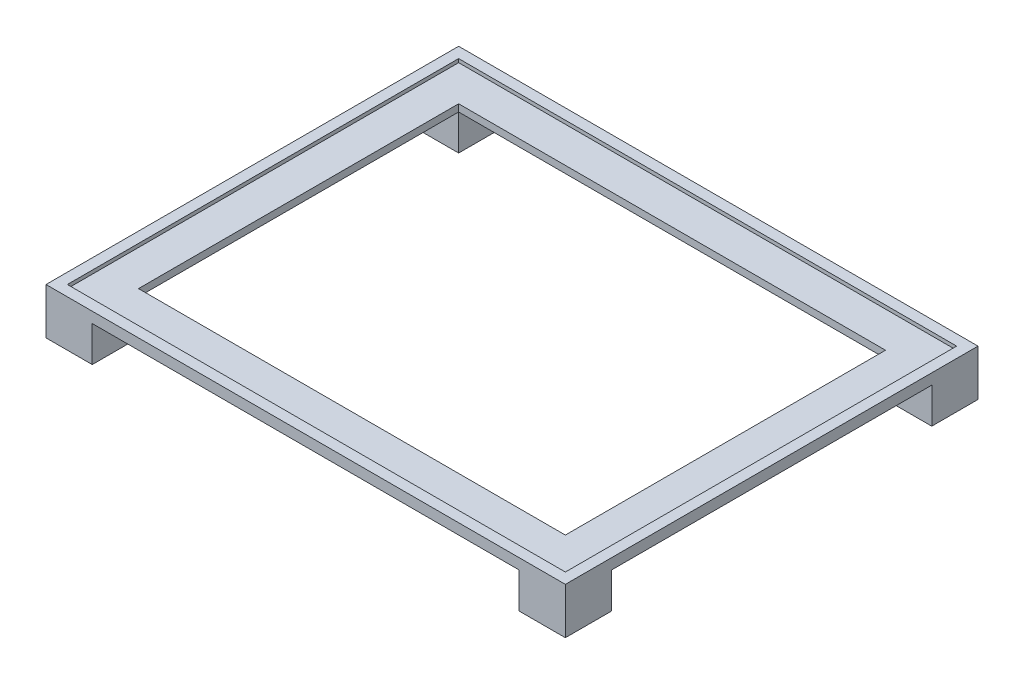
ISO-10303-21;
HEADER;
FILE_DESCRIPTION(('STEP AP214'),'2;1');
FILE_NAME('part.step','',(''),(''),'','','');
FILE_SCHEMA(('AUTOMOTIVE_DESIGN { 1 0 10303 214 1 1 1 1 }'));
ENDSEC;
DATA;
#1=APPLICATION_CONTEXT('core data for automotive mechanical design processes');
#2=APPLICATION_PROTOCOL_DEFINITION('international standard','automotive_design',2000,#1);
#3=PRODUCT_CONTEXT('',#1,'mechanical');
#4=PRODUCT('Part','Part','',(#3));
#5=PRODUCT_RELATED_PRODUCT_CATEGORY('part','',(#4));
#6=PRODUCT_DEFINITION_FORMATION('','',#4);
#7=PRODUCT_DEFINITION_CONTEXT('part definition',#1,'design');
#8=PRODUCT_DEFINITION('design','',#6,#7);
#9=PRODUCT_DEFINITION_SHAPE('','',#8);
#10=(LENGTH_UNIT() NAMED_UNIT(*) SI_UNIT(.MILLI.,.METRE.));
#11=(NAMED_UNIT(*) PLANE_ANGLE_UNIT() SI_UNIT($,.RADIAN.));
#12=(NAMED_UNIT(*) SI_UNIT($,.STERADIAN.) SOLID_ANGLE_UNIT());
#13=UNCERTAINTY_MEASURE_WITH_UNIT(LENGTH_MEASURE(1.E-05),#10,'distance_accuracy_value','');
#14=(GEOMETRIC_REPRESENTATION_CONTEXT(3) GLOBAL_UNCERTAINTY_ASSIGNED_CONTEXT((#13)) GLOBAL_UNIT_ASSIGNED_CONTEXT((#10,
#11,#12)) REPRESENTATION_CONTEXT('',''));
#15=CARTESIAN_POINT('',(0.,0.,0.));
#16=DIRECTION('',(0.,0.,1.));
#17=DIRECTION('',(1.,0.,0.));
#18=AXIS2_PLACEMENT_3D('',#15,#16,#17);
#19=CARTESIAN_POINT('',(0.,0.,0.));
#20=DIRECTION('',(0.,1.,0.));
#21=DIRECTION('',(0.,0.,1.));
#22=AXIS2_PLACEMENT_3D('',#19,#20,#21);
#23=PLANE('',#22);
#24=DIRECTION('',(0.,0.,-1.));
#25=VECTOR('',#24,1.);
#26=CARTESIAN_POINT('',(60.,0.,0.));
#27=LINE('',#26,#25);
#28=CARTESIAN_POINT('',(60.,0.,58.));
#29=VERTEX_POINT('',#28);
#30=CARTESIAN_POINT('',(60.,0.,45.));
#31=VERTEX_POINT('',#30);
#32=EDGE_CURVE('E65',#29,#31,#27,.T.);
#33=ORIENTED_EDGE('',*,*,#32,.F.);
#34=DIRECTION('',(-1.,0.,0.));
#35=VECTOR('',#34,1.);
#36=CARTESIAN_POINT('',(0.,0.,58.));
#37=LINE('',#36,#35);
#38=CARTESIAN_POINT('',(-60.,0.,58.));
#39=VERTEX_POINT('',#38);
#40=EDGE_CURVE('E224',#29,#39,#37,.T.);
#41=ORIENTED_EDGE('',*,*,#40,.T.);
#42=DIRECTION('',(0.,0.,-1.));
#43=VECTOR('',#42,1.);
#44=CARTESIAN_POINT('',(-60.0000000000001,0.,1.28102656687518E-13));
#45=LINE('',#44,#43);
#46=CARTESIAN_POINT('',(-60.,0.,45.));
#47=VERTEX_POINT('',#46);
#48=EDGE_CURVE('E299',#39,#47,#45,.T.);
#49=ORIENTED_EDGE('',*,*,#48,.T.);
#50=DIRECTION('',(-1.,0.,0.));
#51=VECTOR('',#50,1.);
#52=CARTESIAN_POINT('',(0.,0.,45.));
#53=LINE('',#52,#51);
#54=EDGE_CURVE('E338',#31,#47,#53,.T.);
#55=ORIENTED_EDGE('',*,*,#54,.F.);
#56=EDGE_LOOP('',(#33,#41,#49,#55));
#57=FACE_BOUND('',#56,.T.);
#58=ADVANCED_FACE('F47',(#57),#23,.F.);
#59=DIRECTION('',(0.,0.,1.));
#60=VECTOR('',#59,1.);
#61=CARTESIAN_POINT('',(73.,0.,0.));
#62=LINE('',#61,#60);
#63=CARTESIAN_POINT('',(73.,0.,-45.));
#64=VERTEX_POINT('',#63);
#65=CARTESIAN_POINT('',(73.,0.,45.));
#66=VERTEX_POINT('',#65);
#67=EDGE_CURVE('E73',#64,#66,#62,.T.);
#68=ORIENTED_EDGE('',*,*,#67,.T.);
#69=DIRECTION('',(-1.,0.,0.));
#70=VECTOR('',#69,1.);
#71=CARTESIAN_POINT('',(0.,0.,45.));
#72=LINE('',#71,#70);
#73=EDGE_CURVE('E220',#66,#31,#72,.T.);
#74=ORIENTED_EDGE('',*,*,#73,.T.);
#75=DIRECTION('',(0.,0.,1.));
#76=VECTOR('',#75,1.);
#77=CARTESIAN_POINT('',(60.,0.,0.));
#78=LINE('',#77,#76);
#79=CARTESIAN_POINT('',(60.,0.,-45.));
#80=VERTEX_POINT('',#79);
#81=EDGE_CURVE('E369',#80,#31,#78,.T.);
#82=ORIENTED_EDGE('',*,*,#81,.F.);
#83=DIRECTION('',(-1.,0.,0.));
#84=VECTOR('',#83,1.);
#85=CARTESIAN_POINT('',(0.,0.,-45.));
#86=LINE('',#85,#84);
#87=EDGE_CURVE('E230',#64,#80,#86,.T.);
#88=ORIENTED_EDGE('',*,*,#87,.F.);
#89=EDGE_LOOP('',(#68,#74,#82,#88));
#90=FACE_BOUND('',#89,.T.);
#91=ADVANCED_FACE('F479',(#90),#23,.F.);
#92=DIRECTION('',(-1.,0.,0.));
#93=VECTOR('',#92,1.);
#94=CARTESIAN_POINT('',(0.,0.,-58.));
#95=LINE('',#94,#93);
#96=CARTESIAN_POINT('',(60.,0.,-58.));
#97=VERTEX_POINT('',#96);
#98=CARTESIAN_POINT('',(-60.,0.,-58.));
#99=VERTEX_POINT('',#98);
#100=EDGE_CURVE('E391',#97,#99,#95,.T.);
#101=ORIENTED_EDGE('',*,*,#100,.F.);
#102=DIRECTION('',(0.,0.,1.));
#103=VECTOR('',#102,1.);
#104=CARTESIAN_POINT('',(60.,0.,0.));
#105=LINE('',#104,#103);
#106=EDGE_CURVE('E226',#97,#80,#105,.T.);
#107=ORIENTED_EDGE('',*,*,#106,.T.);
#108=DIRECTION('',(-1.,0.,0.));
#109=VECTOR('',#108,1.);
#110=CARTESIAN_POINT('',(0.,0.,-45.));
#111=LINE('',#110,#109);
#112=CARTESIAN_POINT('',(-60.,0.,-45.));
#113=VERTEX_POINT('',#112);
#114=EDGE_CURVE('E365',#80,#113,#111,.T.);
#115=ORIENTED_EDGE('',*,*,#114,.T.);
#116=DIRECTION('',(0.,0.,1.));
#117=VECTOR('',#116,1.);
#118=CARTESIAN_POINT('',(-60.0000000000001,0.,-1.28102656687518E-13));
#119=LINE('',#118,#117);
#120=EDGE_CURVE('E265',#99,#113,#119,.T.);
#121=ORIENTED_EDGE('',*,*,#120,.F.);
#122=EDGE_LOOP('',(#101,#107,#115,#121));
#123=FACE_BOUND('',#122,.T.);
#124=ADVANCED_FACE('F486',(#123),#23,.F.);
#125=CARTESIAN_POINT('',(0.,3.,-58.));
#126=DIRECTION('',(0.,0.,1.));
#127=DIRECTION('',(1.,0.,0.));
#128=AXIS2_PLACEMENT_3D('',#125,#126,#127);
#129=PLANE('',#128);
#130=DIRECTION('',(0.,-1.,0.));
#131=VECTOR('',#130,1.);
#132=CARTESIAN_POINT('',(73.,3.,-58.));
#133=LINE('',#132,#131);
#134=CARTESIAN_POINT('',(73.,3.,-58.));
#135=VERTEX_POINT('',#134);
#136=CARTESIAN_POINT('',(73.,-10.,-58.));
#137=VERTEX_POINT('',#136);
#138=EDGE_CURVE('E431',#135,#137,#133,.T.);
#139=ORIENTED_EDGE('',*,*,#138,.T.);
#140=DIRECTION('',(1.,0.,0.));
#141=VECTOR('',#140,1.);
#142=CARTESIAN_POINT('',(0.,-10.,-58.));
#143=LINE('',#142,#141);
#144=CARTESIAN_POINT('',(60.,-10.,-58.));
#145=VERTEX_POINT('',#144);
#146=EDGE_CURVE('E240',#145,#137,#143,.T.);
#147=ORIENTED_EDGE('',*,*,#146,.F.);
#148=DIRECTION('',(0.,1.,0.));
#149=VECTOR('',#148,1.);
#150=CARTESIAN_POINT('',(60.,-10.,-58.));
#151=LINE('',#150,#149);
#152=EDGE_CURVE('E261',#145,#97,#151,.T.);
#153=ORIENTED_EDGE('',*,*,#152,.T.);
#154=ORIENTED_EDGE('',*,*,#100,.T.);
#155=DIRECTION('',(0.,1.,0.));
#156=VECTOR('',#155,1.);
#157=CARTESIAN_POINT('',(-60.,-10.,-58.));
#158=LINE('',#157,#156);
#159=CARTESIAN_POINT('',(-60.,-10.,-58.));
#160=VERTEX_POINT('',#159);
#161=EDGE_CURVE('E295',#160,#99,#158,.T.);
#162=ORIENTED_EDGE('',*,*,#161,.F.);
#163=DIRECTION('',(1.,0.,0.));
#164=VECTOR('',#163,1.);
#165=CARTESIAN_POINT('',(0.,-10.,-58.));
#166=LINE('',#165,#164);
#167=CARTESIAN_POINT('',(-73.,-10.,-58.));
#168=VERTEX_POINT('',#167);
#169=EDGE_CURVE('E266',#168,#160,#166,.T.);
#170=ORIENTED_EDGE('',*,*,#169,.F.);
#171=DIRECTION('',(0.,-1.,0.));
#172=VECTOR('',#171,1.);
#173=CARTESIAN_POINT('',(-73.,3.,-58.));
#174=LINE('',#173,#172);
#175=CARTESIAN_POINT('',(-73.,3.,-58.));
#176=VERTEX_POINT('',#175);
#177=EDGE_CURVE('E11',#176,#168,#174,.T.);
#178=ORIENTED_EDGE('',*,*,#177,.F.);
#179=DIRECTION('',(-1.,0.,0.));
#180=VECTOR('',#179,1.);
#181=CARTESIAN_POINT('',(0.,3.,-58.));
#182=LINE('',#181,#180);
#183=EDGE_CURVE('E406',#135,#176,#182,.T.);
#184=ORIENTED_EDGE('',*,*,#183,.F.);
#185=EDGE_LOOP('',(#139,#147,#153,#154,#162,#170,#178,#184));
#186=FACE_BOUND('',#185,.T.);
#187=ADVANCED_FACE('F502',(#186),#129,.F.);
#188=CARTESIAN_POINT('',(-73.,3.,0.));
#189=DIRECTION('',(1.,0.,0.));
#190=DIRECTION('',(0.,0.,-1.));
#191=AXIS2_PLACEMENT_3D('',#188,#189,#190);
#192=PLANE('',#191);
#193=ORIENTED_EDGE('',*,*,#177,.T.);
#194=DIRECTION('',(0.,0.,-1.));
#195=VECTOR('',#194,1.);
#196=CARTESIAN_POINT('',(-73.,-10.,0.));
#197=LINE('',#196,#195);
#198=CARTESIAN_POINT('',(-73.,-10.,-45.));
#199=VERTEX_POINT('',#198);
#200=EDGE_CURVE('E278',#199,#168,#197,.T.);
#201=ORIENTED_EDGE('',*,*,#200,.F.);
#202=DIRECTION('',(0.,1.,0.));
#203=VECTOR('',#202,1.);
#204=CARTESIAN_POINT('',(-73.,-10.,-45.));
#205=LINE('',#204,#203);
#206=CARTESIAN_POINT('',(-73.,0.,-45.));
#207=VERTEX_POINT('',#206);
#208=EDGE_CURVE('E282',#199,#207,#205,.T.);
#209=ORIENTED_EDGE('',*,*,#208,.T.);
#210=DIRECTION('',(0.,0.,1.));
#211=VECTOR('',#210,1.);
#212=CARTESIAN_POINT('',(-73.,0.,0.));
#213=LINE('',#212,#211);
#214=CARTESIAN_POINT('',(-73.,0.,45.));
#215=VERTEX_POINT('',#214);
#216=EDGE_CURVE('E424',#207,#215,#213,.T.);
#217=ORIENTED_EDGE('',*,*,#216,.T.);
#218=DIRECTION('',(0.,1.,0.));
#219=VECTOR('',#218,1.);
#220=CARTESIAN_POINT('',(-73.,-10.,45.));
#221=LINE('',#220,#219);
#222=CARTESIAN_POINT('',(-73.,-10.,45.));
#223=VERTEX_POINT('',#222);
#224=EDGE_CURVE('E325',#223,#215,#221,.T.);
#225=ORIENTED_EDGE('',*,*,#224,.F.);
#226=DIRECTION('',(0.,0.,-1.));
#227=VECTOR('',#226,1.);
#228=CARTESIAN_POINT('',(-73.,-10.,0.));
#229=LINE('',#228,#227);
#230=CARTESIAN_POINT('',(-73.,-10.,58.));
#231=VERTEX_POINT('',#230);
#232=EDGE_CURVE('E309',#231,#223,#229,.T.);
#233=ORIENTED_EDGE('',*,*,#232,.F.);
#234=DIRECTION('',(0.,-1.,0.));
#235=VECTOR('',#234,1.);
#236=CARTESIAN_POINT('',(-73.,3.,58.));
#237=LINE('',#236,#235);
#238=CARTESIAN_POINT('',(-73.,3.,58.));
#239=VERTEX_POINT('',#238);
#240=EDGE_CURVE('E57',#239,#231,#237,.T.);
#241=ORIENTED_EDGE('',*,*,#240,.F.);
#242=DIRECTION('',(0.,0.,1.));
#243=VECTOR('',#242,1.);
#244=CARTESIAN_POINT('',(-73.,3.,0.));
#245=LINE('',#244,#243);
#246=EDGE_CURVE('E410',#176,#239,#245,.T.);
#247=ORIENTED_EDGE('',*,*,#246,.F.);
#248=EDGE_LOOP('',(#193,#201,#209,#217,#225,#233,#241,#247));
#249=FACE_BOUND('',#248,.T.);
#250=ADVANCED_FACE('F507',(#249),#192,.F.);
#251=CARTESIAN_POINT('',(0.,3.,58.));
#252=DIRECTION('',(0.,0.,1.));
#253=DIRECTION('',(1.,0.,0.));
#254=AXIS2_PLACEMENT_3D('',#251,#252,#253);
#255=PLANE('',#254);
#256=ORIENTED_EDGE('',*,*,#40,.F.);
#257=DIRECTION('',(0.,1.,0.));
#258=VECTOR('',#257,1.);
#259=CARTESIAN_POINT('',(60.,-10.,58.));
#260=LINE('',#259,#258);
#261=CARTESIAN_POINT('',(60.,-10.,58.));
#262=VERTEX_POINT('',#261);
#263=EDGE_CURVE('E203',#262,#29,#260,.T.);
#264=ORIENTED_EDGE('',*,*,#263,.F.);
#265=DIRECTION('',(-1.,0.,0.));
#266=VECTOR('',#265,1.);
#267=CARTESIAN_POINT('',(0.,-10.,58.));
#268=LINE('',#267,#266);
#269=CARTESIAN_POINT('',(73.,-10.,58.));
#270=VERTEX_POINT('',#269);
#271=EDGE_CURVE('E211',#270,#262,#268,.T.);
#272=ORIENTED_EDGE('',*,*,#271,.F.);
#273=DIRECTION('',(0.,-1.,0.));
#274=VECTOR('',#273,1.);
#275=CARTESIAN_POINT('',(73.,3.,58.));
#276=LINE('',#275,#274);
#277=CARTESIAN_POINT('',(73.,3.,58.));
#278=VERTEX_POINT('',#277);
#279=EDGE_CURVE('E434',#278,#270,#276,.T.);
#280=ORIENTED_EDGE('',*,*,#279,.F.);
#281=DIRECTION('',(-1.,0.,0.));
#282=VECTOR('',#281,1.);
#283=CARTESIAN_POINT('',(0.,3.,58.));
#284=LINE('',#283,#282);
#285=EDGE_CURVE('E413',#278,#239,#284,.T.);
#286=ORIENTED_EDGE('',*,*,#285,.T.);
#287=ORIENTED_EDGE('',*,*,#240,.T.);
#288=DIRECTION('',(-1.,0.,0.));
#289=VECTOR('',#288,1.);
#290=CARTESIAN_POINT('',(0.,-10.,58.));
#291=LINE('',#290,#289);
#292=CARTESIAN_POINT('',(-60.,-10.,58.));
#293=VERTEX_POINT('',#292);
#294=EDGE_CURVE('E304',#293,#231,#291,.T.);
#295=ORIENTED_EDGE('',*,*,#294,.F.);
#296=DIRECTION('',(0.,1.,0.));
#297=VECTOR('',#296,1.);
#298=CARTESIAN_POINT('',(-60.,-10.,58.));
#299=LINE('',#298,#297);
#300=EDGE_CURVE('E329',#293,#39,#299,.T.);
#301=ORIENTED_EDGE('',*,*,#300,.T.);
#302=EDGE_LOOP('',(#256,#264,#272,#280,#286,#287,#295,#301));
#303=FACE_BOUND('',#302,.T.);
#304=ADVANCED_FACE('F222',(#303),#255,.T.);
#305=CARTESIAN_POINT('',(-70.,3.,0.));
#306=DIRECTION('',(1.,0.,0.));
#307=DIRECTION('',(0.,0.,-1.));
#308=AXIS2_PLACEMENT_3D('',#305,#306,#307);
#309=PLANE('',#308);
#310=DIRECTION('',(0.,0.,1.));
#311=VECTOR('',#310,1.);
#312=CARTESIAN_POINT('',(-70.,2.,0.));
#313=LINE('',#312,#311);
#314=CARTESIAN_POINT('',(-70.,2.,-55.));
#315=VERTEX_POINT('',#314);
#316=CARTESIAN_POINT('',(-70.,2.,55.));
#317=VERTEX_POINT('',#316);
#318=EDGE_CURVE('E351',#315,#317,#313,.T.);
#319=ORIENTED_EDGE('',*,*,#318,.F.);
#320=DIRECTION('',(0.,-1.,0.));
#321=VECTOR('',#320,1.);
#322=CARTESIAN_POINT('',(-70.,3.,-55.));
#323=LINE('',#322,#321);
#324=CARTESIAN_POINT('',(-70.,3.,-55.));
#325=VERTEX_POINT('',#324);
#326=EDGE_CURVE('E51',#325,#315,#323,.T.);
#327=ORIENTED_EDGE('',*,*,#326,.F.);
#328=DIRECTION('',(0.,0.,1.));
#329=VECTOR('',#328,1.);
#330=CARTESIAN_POINT('',(-70.,3.,0.));
#331=LINE('',#330,#329);
#332=CARTESIAN_POINT('',(-70.,3.,55.));
#333=VERTEX_POINT('',#332);
#334=EDGE_CURVE('E392',#325,#333,#331,.T.);
#335=ORIENTED_EDGE('',*,*,#334,.T.);
#336=DIRECTION('',(0.,-1.,0.));
#337=VECTOR('',#336,1.);
#338=CARTESIAN_POINT('',(-70.,3.,55.));
#339=LINE('',#338,#337);
#340=EDGE_CURVE('E421',#333,#317,#339,.T.);
#341=ORIENTED_EDGE('',*,*,#340,.T.);
#342=EDGE_LOOP('',(#319,#327,#335,#341));
#343=FACE_BOUND('',#342,.T.);
#344=ADVANCED_FACE('F49',(#343),#309,.T.);
#345=CARTESIAN_POINT('',(0.,3.,-55.));
#346=DIRECTION('',(0.,0.,1.));
#347=DIRECTION('',(1.,0.,0.));
#348=AXIS2_PLACEMENT_3D('',#345,#346,#347);
#349=PLANE('',#348);
#350=DIRECTION('',(-1.,0.,0.));
#351=VECTOR('',#350,1.);
#352=CARTESIAN_POINT('',(0.,2.,-55.));
#353=LINE('',#352,#351);
#354=CARTESIAN_POINT('',(70.,2.,-55.));
#355=VERTEX_POINT('',#354);
#356=EDGE_CURVE('E348',#355,#315,#353,.T.);
#357=ORIENTED_EDGE('',*,*,#356,.F.);
#358=DIRECTION('',(0.,-1.,0.));
#359=VECTOR('',#358,1.);
#360=CARTESIAN_POINT('',(70.,3.,-55.));
#361=LINE('',#360,#359);
#362=CARTESIAN_POINT('',(70.,3.,-55.));
#363=VERTEX_POINT('',#362);
#364=EDGE_CURVE('E445',#363,#355,#361,.T.);
#365=ORIENTED_EDGE('',*,*,#364,.F.);
#366=DIRECTION('',(-1.,0.,0.));
#367=VECTOR('',#366,1.);
#368=CARTESIAN_POINT('',(0.,3.,-55.));
#369=LINE('',#368,#367);
#370=EDGE_CURVE('E396',#363,#325,#369,.T.);
#371=ORIENTED_EDGE('',*,*,#370,.T.);
#372=ORIENTED_EDGE('',*,*,#326,.T.);
#373=EDGE_LOOP('',(#357,#365,#371,#372));
#374=FACE_BOUND('',#373,.T.);
#375=ADVANCED_FACE('F454',(#374),#349,.T.);
#376=CARTESIAN_POINT('',(70.,3.,0.));
#377=DIRECTION('',(1.,0.,0.));
#378=DIRECTION('',(0.,0.,-1.));
#379=AXIS2_PLACEMENT_3D('',#376,#377,#378);
#380=PLANE('',#379);
#381=ORIENTED_EDGE('',*,*,#364,.T.);
#382=DIRECTION('',(0.,0.,1.));
#383=VECTOR('',#382,1.);
#384=CARTESIAN_POINT('',(70.,2.,0.));
#385=LINE('',#384,#383);
#386=CARTESIAN_POINT('',(70.,2.,55.));
#387=VERTEX_POINT('',#386);
#388=EDGE_CURVE('E358',#355,#387,#385,.T.);
#389=ORIENTED_EDGE('',*,*,#388,.T.);
#390=DIRECTION('',(0.,-1.,0.));
#391=VECTOR('',#390,1.);
#392=CARTESIAN_POINT('',(70.,3.,55.));
#393=LINE('',#392,#391);
#394=CARTESIAN_POINT('',(70.,3.,55.));
#395=VERTEX_POINT('',#394);
#396=EDGE_CURVE('E442',#395,#387,#393,.T.);
#397=ORIENTED_EDGE('',*,*,#396,.F.);
#398=DIRECTION('',(0.,0.,1.));
#399=VECTOR('',#398,1.);
#400=CARTESIAN_POINT('',(70.,3.,0.));
#401=LINE('',#400,#399);
#402=EDGE_CURVE('E400',#363,#395,#401,.T.);
#403=ORIENTED_EDGE('',*,*,#402,.F.);
#404=EDGE_LOOP('',(#381,#389,#397,#403));
#405=FACE_BOUND('',#404,.T.);
#406=ADVANCED_FACE('F469',(#405),#380,.F.);
#407=CARTESIAN_POINT('',(0.,3.,55.));
#408=DIRECTION('',(0.,0.,1.));
#409=DIRECTION('',(1.,0.,0.));
#410=AXIS2_PLACEMENT_3D('',#407,#408,#409);
#411=PLANE('',#410);
#412=ORIENTED_EDGE('',*,*,#396,.T.);
#413=DIRECTION('',(-1.,0.,0.));
#414=VECTOR('',#413,1.);
#415=CARTESIAN_POINT('',(0.,2.,55.));
#416=LINE('',#415,#414);
#417=EDGE_CURVE('E354',#387,#317,#416,.T.);
#418=ORIENTED_EDGE('',*,*,#417,.T.);
#419=ORIENTED_EDGE('',*,*,#340,.F.);
#420=DIRECTION('',(-1.,0.,0.));
#421=VECTOR('',#420,1.);
#422=CARTESIAN_POINT('',(0.,3.,55.));
#423=LINE('',#422,#421);
#424=EDGE_CURVE('E403',#395,#333,#423,.T.);
#425=ORIENTED_EDGE('',*,*,#424,.F.);
#426=EDGE_LOOP('',(#412,#418,#419,#425));
#427=FACE_BOUND('',#426,.T.);
#428=ADVANCED_FACE('F466',(#427),#411,.F.);
#429=CARTESIAN_POINT('',(73.,3.,0.));
#430=DIRECTION('',(1.,0.,0.));
#431=DIRECTION('',(0.,0.,-1.));
#432=AXIS2_PLACEMENT_3D('',#429,#430,#431);
#433=PLANE('',#432);
#434=ORIENTED_EDGE('',*,*,#67,.F.);
#435=DIRECTION('',(0.,1.,0.));
#436=VECTOR('',#435,1.);
#437=CARTESIAN_POINT('',(73.,-10.,-45.));
#438=LINE('',#437,#436);
#439=CARTESIAN_POINT('',(73.,-10.,-45.));
#440=VERTEX_POINT('',#439);
#441=EDGE_CURVE('E257',#440,#64,#438,.T.);
#442=ORIENTED_EDGE('',*,*,#441,.F.);
#443=DIRECTION('',(0.,0.,1.));
#444=VECTOR('',#443,1.);
#445=CARTESIAN_POINT('',(73.,-10.,0.));
#446=LINE('',#445,#444);
#447=EDGE_CURVE('E244',#137,#440,#446,.T.);
#448=ORIENTED_EDGE('',*,*,#447,.F.);
#449=ORIENTED_EDGE('',*,*,#138,.F.);
#450=DIRECTION('',(0.,0.,1.));
#451=VECTOR('',#450,1.);
#452=CARTESIAN_POINT('',(73.,3.,0.));
#453=LINE('',#452,#451);
#454=EDGE_CURVE('E417',#135,#278,#453,.T.);
#455=ORIENTED_EDGE('',*,*,#454,.T.);
#456=ORIENTED_EDGE('',*,*,#279,.T.);
#457=DIRECTION('',(0.,0.,1.));
#458=VECTOR('',#457,1.);
#459=CARTESIAN_POINT('',(73.,-10.,0.));
#460=LINE('',#459,#458);
#461=CARTESIAN_POINT('',(73.,-10.,45.));
#462=VERTEX_POINT('',#461);
#463=EDGE_CURVE('E217',#462,#270,#460,.T.);
#464=ORIENTED_EDGE('',*,*,#463,.F.);
#465=DIRECTION('',(0.,1.,0.));
#466=VECTOR('',#465,1.);
#467=CARTESIAN_POINT('',(73.,-10.,45.));
#468=LINE('',#467,#466);
#469=EDGE_CURVE('E232',#462,#66,#468,.T.);
#470=ORIENTED_EDGE('',*,*,#469,.T.);
#471=EDGE_LOOP('',(#434,#442,#448,#449,#455,#456,#464,#470));
#472=FACE_BOUND('',#471,.T.);
#473=ADVANCED_FACE('F476',(#472),#433,.T.);
#474=CARTESIAN_POINT('',(0.,3.,0.));
#475=DIRECTION('',(0.,1.,0.));
#476=DIRECTION('',(0.,0.,1.));
#477=AXIS2_PLACEMENT_3D('',#474,#475,#476);
#478=PLANE('',#477);
#479=ORIENTED_EDGE('',*,*,#334,.F.);
#480=ORIENTED_EDGE('',*,*,#370,.F.);
#481=ORIENTED_EDGE('',*,*,#402,.T.);
#482=ORIENTED_EDGE('',*,*,#424,.T.);
#483=EDGE_LOOP('',(#479,#480,#481,#482));
#484=FACE_BOUND('',#483,.T.);
#485=ORIENTED_EDGE('',*,*,#183,.T.);
#486=ORIENTED_EDGE('',*,*,#246,.T.);
#487=ORIENTED_EDGE('',*,*,#285,.F.);
#488=ORIENTED_EDGE('',*,*,#454,.F.);
#489=EDGE_LOOP('',(#485,#486,#487,#488));
#490=FACE_BOUND('',#489,.T.);
#491=ADVANCED_FACE('F460',(#484,#490),#478,.T.);
#492=ORIENTED_EDGE('',*,*,#216,.F.);
#493=DIRECTION('',(1.,0.,0.));
#494=VECTOR('',#493,1.);
#495=CARTESIAN_POINT('',(0.,0.,-45.));
#496=LINE('',#495,#494);
#497=EDGE_CURVE('E271',#207,#113,#496,.T.);
#498=ORIENTED_EDGE('',*,*,#497,.T.);
#499=DIRECTION('',(0.,0.,1.));
#500=VECTOR('',#499,1.);
#501=CARTESIAN_POINT('',(-60.,0.,0.));
#502=LINE('',#501,#500);
#503=EDGE_CURVE('E332',#113,#47,#502,.T.);
#504=ORIENTED_EDGE('',*,*,#503,.T.);
#505=DIRECTION('',(1.,0.,0.));
#506=VECTOR('',#505,1.);
#507=CARTESIAN_POINT('',(0.,0.,45.));
#508=LINE('',#507,#506);
#509=EDGE_CURVE('E305',#215,#47,#508,.T.);
#510=ORIENTED_EDGE('',*,*,#509,.F.);
#511=EDGE_LOOP('',(#492,#498,#504,#510));
#512=FACE_BOUND('',#511,.T.);
#513=ADVANCED_FACE('F481',(#512),#23,.F.);
#514=CARTESIAN_POINT('',(-60.,2.,0.));
#515=DIRECTION('',(1.,0.,0.));
#516=DIRECTION('',(0.,0.,-1.));
#517=AXIS2_PLACEMENT_3D('',#514,#515,#516);
#518=PLANE('',#517);
#519=ORIENTED_EDGE('',*,*,#503,.F.);
#520=DIRECTION('',(0.,-1.,0.));
#521=VECTOR('',#520,1.);
#522=CARTESIAN_POINT('',(-60.,2.,-45.));
#523=LINE('',#522,#521);
#524=CARTESIAN_POINT('',(-60.,2.,-45.));
#525=VERTEX_POINT('',#524);
#526=EDGE_CURVE('E387',#525,#113,#523,.T.);
#527=ORIENTED_EDGE('',*,*,#526,.F.);
#528=DIRECTION('',(0.,0.,1.));
#529=VECTOR('',#528,1.);
#530=CARTESIAN_POINT('',(-60.,2.,0.));
#531=LINE('',#530,#529);
#532=CARTESIAN_POINT('',(-60.,2.,45.));
#533=VERTEX_POINT('',#532);
#534=EDGE_CURVE('E333',#525,#533,#531,.T.);
#535=ORIENTED_EDGE('',*,*,#534,.T.);
#536=DIRECTION('',(0.,-1.,0.));
#537=VECTOR('',#536,1.);
#538=CARTESIAN_POINT('',(-60.,2.,45.));
#539=LINE('',#538,#537);
#540=EDGE_CURVE('E362',#533,#47,#539,.T.);
#541=ORIENTED_EDGE('',*,*,#540,.T.);
#542=EDGE_LOOP('',(#519,#527,#535,#541));
#543=FACE_BOUND('',#542,.T.);
#544=ADVANCED_FACE('F490',(#543),#518,.T.);
#545=CARTESIAN_POINT('',(0.,2.,-45.));
#546=DIRECTION('',(0.,0.,1.));
#547=DIRECTION('',(1.,0.,0.));
#548=AXIS2_PLACEMENT_3D('',#545,#546,#547);
#549=PLANE('',#548);
#550=ORIENTED_EDGE('',*,*,#114,.F.);
#551=DIRECTION('',(0.,-1.,0.));
#552=VECTOR('',#551,1.);
#553=CARTESIAN_POINT('',(60.,2.,-45.));
#554=LINE('',#553,#552);
#555=CARTESIAN_POINT('',(60.,2.,-45.));
#556=VERTEX_POINT('',#555);
#557=EDGE_CURVE('E383',#556,#80,#554,.T.);
#558=ORIENTED_EDGE('',*,*,#557,.F.);
#559=DIRECTION('',(-1.,0.,0.));
#560=VECTOR('',#559,1.);
#561=CARTESIAN_POINT('',(0.,2.,-45.));
#562=LINE('',#561,#560);
#563=EDGE_CURVE('E337',#556,#525,#562,.T.);
#564=ORIENTED_EDGE('',*,*,#563,.T.);
#565=ORIENTED_EDGE('',*,*,#526,.T.);
#566=EDGE_LOOP('',(#550,#558,#564,#565));
#567=FACE_BOUND('',#566,.T.);
#568=ADVANCED_FACE('F496',(#567),#549,.T.);
#569=CARTESIAN_POINT('',(60.,2.,0.));
#570=DIRECTION('',(1.,0.,0.));
#571=DIRECTION('',(0.,0.,-1.));
#572=AXIS2_PLACEMENT_3D('',#569,#570,#571);
#573=PLANE('',#572);
#574=ORIENTED_EDGE('',*,*,#81,.T.);
#575=DIRECTION('',(0.,-1.,0.));
#576=VECTOR('',#575,1.);
#577=CARTESIAN_POINT('',(60.,2.,45.));
#578=LINE('',#577,#576);
#579=CARTESIAN_POINT('',(60.,2.,45.));
#580=VERTEX_POINT('',#579);
#581=EDGE_CURVE('E379',#580,#31,#578,.T.);
#582=ORIENTED_EDGE('',*,*,#581,.F.);
#583=DIRECTION('',(0.,0.,1.));
#584=VECTOR('',#583,1.);
#585=CARTESIAN_POINT('',(60.,2.,0.));
#586=LINE('',#585,#584);
#587=EDGE_CURVE('E342',#556,#580,#586,.T.);
#588=ORIENTED_EDGE('',*,*,#587,.F.);
#589=ORIENTED_EDGE('',*,*,#557,.T.);
#590=EDGE_LOOP('',(#574,#582,#588,#589));
#591=FACE_BOUND('',#590,.T.);
#592=ADVANCED_FACE('F600',(#591),#573,.F.);
#593=CARTESIAN_POINT('',(0.,2.,45.));
#594=DIRECTION('',(0.,0.,1.));
#595=DIRECTION('',(1.,0.,0.));
#596=AXIS2_PLACEMENT_3D('',#593,#594,#595);
#597=PLANE('',#596);
#598=ORIENTED_EDGE('',*,*,#54,.T.);
#599=ORIENTED_EDGE('',*,*,#540,.F.);
#600=DIRECTION('',(-1.,0.,0.));
#601=VECTOR('',#600,1.);
#602=CARTESIAN_POINT('',(0.,2.,45.));
#603=LINE('',#602,#601);
#604=EDGE_CURVE('E345',#580,#533,#603,.T.);
#605=ORIENTED_EDGE('',*,*,#604,.F.);
#606=ORIENTED_EDGE('',*,*,#581,.T.);
#607=EDGE_LOOP('',(#598,#599,#605,#606));
#608=FACE_BOUND('',#607,.T.);
#609=ADVANCED_FACE('F535',(#608),#597,.F.);
#610=CARTESIAN_POINT('',(0.,2.,0.));
#611=DIRECTION('',(0.,1.,0.));
#612=DIRECTION('',(0.,0.,1.));
#613=AXIS2_PLACEMENT_3D('',#610,#611,#612);
#614=PLANE('',#613);
#615=ORIENTED_EDGE('',*,*,#534,.F.);
#616=ORIENTED_EDGE('',*,*,#563,.F.);
#617=ORIENTED_EDGE('',*,*,#587,.T.);
#618=ORIENTED_EDGE('',*,*,#604,.T.);
#619=EDGE_LOOP('',(#615,#616,#617,#618));
#620=FACE_BOUND('',#619,.T.);
#621=ORIENTED_EDGE('',*,*,#356,.T.);
#622=ORIENTED_EDGE('',*,*,#318,.T.);
#623=ORIENTED_EDGE('',*,*,#417,.F.);
#624=ORIENTED_EDGE('',*,*,#388,.F.);
#625=EDGE_LOOP('',(#621,#622,#623,#624));
#626=FACE_BOUND('',#625,.T.);
#627=ADVANCED_FACE('F468',(#620,#626),#614,.T.);
#628=CARTESIAN_POINT('',(-60.0000000000001,-10.,1.28102656687518E-13));
#629=DIRECTION('',(1.,0.,0.));
#630=DIRECTION('',(0.,0.,-1.));
#631=AXIS2_PLACEMENT_3D('',#628,#629,#630);
#632=PLANE('',#631);
#633=ORIENTED_EDGE('',*,*,#48,.F.);
#634=ORIENTED_EDGE('',*,*,#300,.F.);
#635=DIRECTION('',(0.,0.,-1.));
#636=VECTOR('',#635,1.);
#637=CARTESIAN_POINT('',(-60.0000000000001,-10.,1.28102656687518E-13));
#638=LINE('',#637,#636);
#639=CARTESIAN_POINT('',(-60.,-10.,45.));
#640=VERTEX_POINT('',#639);
#641=EDGE_CURVE('E300',#293,#640,#638,.T.);
#642=ORIENTED_EDGE('',*,*,#641,.T.);
#643=DIRECTION('',(0.,1.,0.));
#644=VECTOR('',#643,1.);
#645=CARTESIAN_POINT('',(-60.,-10.,45.));
#646=LINE('',#645,#644);
#647=EDGE_CURVE('E315',#640,#47,#646,.T.);
#648=ORIENTED_EDGE('',*,*,#647,.T.);
#649=EDGE_LOOP('',(#633,#634,#642,#648));
#650=FACE_BOUND('',#649,.T.);
#651=ADVANCED_FACE('F565',(#650),#632,.T.);
#652=CARTESIAN_POINT('',(0.,-10.,45.));
#653=DIRECTION('',(0.,0.,1.));
#654=DIRECTION('',(1.,0.,0.));
#655=AXIS2_PLACEMENT_3D('',#652,#653,#654);
#656=PLANE('',#655);
#657=ORIENTED_EDGE('',*,*,#509,.T.);
#658=ORIENTED_EDGE('',*,*,#647,.F.);
#659=DIRECTION('',(1.,0.,0.));
#660=VECTOR('',#659,1.);
#661=CARTESIAN_POINT('',(0.,-10.,45.));
#662=LINE('',#661,#660);
#663=EDGE_CURVE('E312',#223,#640,#662,.T.);
#664=ORIENTED_EDGE('',*,*,#663,.F.);
#665=ORIENTED_EDGE('',*,*,#224,.T.);
#666=EDGE_LOOP('',(#657,#658,#664,#665));
#667=FACE_BOUND('',#666,.T.);
#668=ADVANCED_FACE('F567',(#667),#656,.F.);
#669=CARTESIAN_POINT('',(0.,-10.,0.));
#670=DIRECTION('',(0.,-1.,0.));
#671=DIRECTION('',(0.,0.,-1.));
#672=AXIS2_PLACEMENT_3D('',#669,#670,#671);
#673=PLANE('',#672);
#674=ORIENTED_EDGE('',*,*,#641,.F.);
#675=ORIENTED_EDGE('',*,*,#294,.T.);
#676=ORIENTED_EDGE('',*,*,#232,.T.);
#677=ORIENTED_EDGE('',*,*,#663,.T.);
#678=EDGE_LOOP('',(#674,#675,#676,#677));
#679=FACE_BOUND('',#678,.T.);
#680=ADVANCED_FACE('F561',(#679),#673,.T.);
#681=CARTESIAN_POINT('',(-60.0000000000001,-10.,-1.28102656687518E-13));
#682=DIRECTION('',(-1.,0.,0.));
#683=DIRECTION('',(0.,0.,1.));
#684=AXIS2_PLACEMENT_3D('',#681,#682,#683);
#685=PLANE('',#684);
#686=ORIENTED_EDGE('',*,*,#120,.T.);
#687=DIRECTION('',(0.,1.,0.));
#688=VECTOR('',#687,1.);
#689=CARTESIAN_POINT('',(-60.,-10.,-45.));
#690=LINE('',#689,#688);
#691=CARTESIAN_POINT('',(-60.,-10.,-45.));
#692=VERTEX_POINT('',#691);
#693=EDGE_CURVE('E292',#692,#113,#690,.T.);
#694=ORIENTED_EDGE('',*,*,#693,.F.);
#695=DIRECTION('',(0.,0.,1.));
#696=VECTOR('',#695,1.);
#697=CARTESIAN_POINT('',(-60.0000000000001,-10.,-1.28102656687518E-13));
#698=LINE('',#697,#696);
#699=EDGE_CURVE('E270',#160,#692,#698,.T.);
#700=ORIENTED_EDGE('',*,*,#699,.F.);
#701=ORIENTED_EDGE('',*,*,#161,.T.);
#702=EDGE_LOOP('',(#686,#694,#700,#701));
#703=FACE_BOUND('',#702,.T.);
#704=ADVANCED_FACE('F574',(#703),#685,.F.);
#705=CARTESIAN_POINT('',(0.,-10.,-45.));
#706=DIRECTION('',(0.,0.,1.));
#707=DIRECTION('',(1.,0.,0.));
#708=AXIS2_PLACEMENT_3D('',#705,#706,#707);
#709=PLANE('',#708);
#710=ORIENTED_EDGE('',*,*,#497,.F.);
#711=ORIENTED_EDGE('',*,*,#208,.F.);
#712=DIRECTION('',(1.,0.,0.));
#713=VECTOR('',#712,1.);
#714=CARTESIAN_POINT('',(0.,-10.,-45.));
#715=LINE('',#714,#713);
#716=EDGE_CURVE('E274',#199,#692,#715,.T.);
#717=ORIENTED_EDGE('',*,*,#716,.T.);
#718=ORIENTED_EDGE('',*,*,#693,.T.);
#719=EDGE_LOOP('',(#710,#711,#717,#718));
#720=FACE_BOUND('',#719,.T.);
#721=ADVANCED_FACE('F571',(#720),#709,.T.);
#722=CARTESIAN_POINT('',(0.,-10.,0.));
#723=DIRECTION('',(0.,-1.,0.));
#724=DIRECTION('',(0.,0.,-1.));
#725=AXIS2_PLACEMENT_3D('',#722,#723,#724);
#726=PLANE('',#725);
#727=ORIENTED_EDGE('',*,*,#169,.T.);
#728=ORIENTED_EDGE('',*,*,#699,.T.);
#729=ORIENTED_EDGE('',*,*,#716,.F.);
#730=ORIENTED_EDGE('',*,*,#200,.T.);
#731=EDGE_LOOP('',(#727,#728,#729,#730));
#732=FACE_BOUND('',#731,.T.);
#733=ADVANCED_FACE('F577',(#732),#726,.T.);
#734=CARTESIAN_POINT('',(60.,-10.,0.));
#735=DIRECTION('',(-1.,0.,0.));
#736=DIRECTION('',(0.,0.,1.));
#737=AXIS2_PLACEMENT_3D('',#734,#735,#736);
#738=PLANE('',#737);
#739=ORIENTED_EDGE('',*,*,#106,.F.);
#740=ORIENTED_EDGE('',*,*,#152,.F.);
#741=DIRECTION('',(0.,0.,1.));
#742=VECTOR('',#741,1.);
#743=CARTESIAN_POINT('',(60.,-10.,0.));
#744=LINE('',#743,#742);
#745=CARTESIAN_POINT('',(60.,-10.,-45.));
#746=VERTEX_POINT('',#745);
#747=EDGE_CURVE('E236',#145,#746,#744,.T.);
#748=ORIENTED_EDGE('',*,*,#747,.T.);
#749=DIRECTION('',(0.,1.,0.));
#750=VECTOR('',#749,1.);
#751=CARTESIAN_POINT('',(60.,-10.,-45.));
#752=LINE('',#751,#750);
#753=EDGE_CURVE('E249',#746,#80,#752,.T.);
#754=ORIENTED_EDGE('',*,*,#753,.T.);
#755=EDGE_LOOP('',(#739,#740,#748,#754));
#756=FACE_BOUND('',#755,.T.);
#757=ADVANCED_FACE('F516',(#756),#738,.T.);
#758=CARTESIAN_POINT('',(0.,-10.,-45.));
#759=DIRECTION('',(0.,0.,-1.));
#760=DIRECTION('',(-1.,0.,0.));
#761=AXIS2_PLACEMENT_3D('',#758,#759,#760);
#762=PLANE('',#761);
#763=ORIENTED_EDGE('',*,*,#87,.T.);
#764=ORIENTED_EDGE('',*,*,#753,.F.);
#765=DIRECTION('',(-1.,0.,0.));
#766=VECTOR('',#765,1.);
#767=CARTESIAN_POINT('',(0.,-10.,-45.));
#768=LINE('',#767,#766);
#769=EDGE_CURVE('E247',#440,#746,#768,.T.);
#770=ORIENTED_EDGE('',*,*,#769,.F.);
#771=ORIENTED_EDGE('',*,*,#441,.T.);
#772=EDGE_LOOP('',(#763,#764,#770,#771));
#773=FACE_BOUND('',#772,.T.);
#774=ADVANCED_FACE('F520',(#773),#762,.F.);
#775=CARTESIAN_POINT('',(0.,-10.,0.));
#776=DIRECTION('',(0.,-1.,0.));
#777=DIRECTION('',(0.,0.,-1.));
#778=AXIS2_PLACEMENT_3D('',#775,#776,#777);
#779=PLANE('',#778);
#780=ORIENTED_EDGE('',*,*,#747,.F.);
#781=ORIENTED_EDGE('',*,*,#146,.T.);
#782=ORIENTED_EDGE('',*,*,#447,.T.);
#783=ORIENTED_EDGE('',*,*,#769,.T.);
#784=EDGE_LOOP('',(#780,#781,#782,#783));
#785=FACE_BOUND('',#784,.T.);
#786=ADVANCED_FACE('F665',(#785),#779,.T.);
#787=CARTESIAN_POINT('',(60.,-10.,0.));
#788=DIRECTION('',(1.,0.,0.));
#789=DIRECTION('',(0.,0.,-1.));
#790=AXIS2_PLACEMENT_3D('',#787,#788,#789);
#791=PLANE('',#790);
#792=ORIENTED_EDGE('',*,*,#32,.T.);
#793=DIRECTION('',(0.,1.,0.));
#794=VECTOR('',#793,1.);
#795=CARTESIAN_POINT('',(60.,-10.,45.));
#796=LINE('',#795,#794);
#797=CARTESIAN_POINT('',(60.,-10.,45.));
#798=VERTEX_POINT('',#797);
#799=EDGE_CURVE('E205',#798,#31,#796,.T.);
#800=ORIENTED_EDGE('',*,*,#799,.F.);
#801=DIRECTION('',(0.,0.,-1.));
#802=VECTOR('',#801,1.);
#803=CARTESIAN_POINT('',(60.,-10.,0.));
#804=LINE('',#803,#802);
#805=EDGE_CURVE('E199',#262,#798,#804,.T.);
#806=ORIENTED_EDGE('',*,*,#805,.F.);
#807=ORIENTED_EDGE('',*,*,#263,.T.);
#808=EDGE_LOOP('',(#792,#800,#806,#807));
#809=FACE_BOUND('',#808,.T.);
#810=ADVANCED_FACE('F201',(#809),#791,.F.);
#811=CARTESIAN_POINT('',(0.,-10.,45.));
#812=DIRECTION('',(0.,0.,-1.));
#813=DIRECTION('',(-1.,0.,0.));
#814=AXIS2_PLACEMENT_3D('',#811,#812,#813);
#815=PLANE('',#814);
#816=ORIENTED_EDGE('',*,*,#73,.F.);
#817=ORIENTED_EDGE('',*,*,#469,.F.);
#818=DIRECTION('',(-1.,0.,0.));
#819=VECTOR('',#818,1.);
#820=CARTESIAN_POINT('',(0.,-10.,45.));
#821=LINE('',#820,#819);
#822=EDGE_CURVE('E210',#462,#798,#821,.T.);
#823=ORIENTED_EDGE('',*,*,#822,.T.);
#824=ORIENTED_EDGE('',*,*,#799,.T.);
#825=EDGE_LOOP('',(#816,#817,#823,#824));
#826=FACE_BOUND('',#825,.T.);
#827=ADVANCED_FACE('F539',(#826),#815,.T.);
#828=CARTESIAN_POINT('',(0.,-10.,0.));
#829=DIRECTION('',(0.,-1.,0.));
#830=DIRECTION('',(0.,0.,-1.));
#831=AXIS2_PLACEMENT_3D('',#828,#829,#830);
#832=PLANE('',#831);
#833=ORIENTED_EDGE('',*,*,#271,.T.);
#834=ORIENTED_EDGE('',*,*,#805,.T.);
#835=ORIENTED_EDGE('',*,*,#822,.F.);
#836=ORIENTED_EDGE('',*,*,#463,.T.);
#837=EDGE_LOOP('',(#833,#834,#835,#836));
#838=FACE_BOUND('',#837,.T.);
#839=ADVANCED_FACE('F215',(#838),#832,.T.);
#840=CLOSED_SHELL('',(#58,#91,#124,#187,#250,#304,#344,#375,#406,#428,#473,#491,#513,#544,#568,
#592,#609,#627,#651,#668,#680,#704,#721,#733,#757,#774,#786,#810,#827,#839));
#841=MANIFOLD_SOLID_BREP('B2',#840);
#842=ADVANCED_BREP_SHAPE_REPRESENTATION('',(#18,#841),#14);
#843=SHAPE_DEFINITION_REPRESENTATION(#9,#842);
ENDSEC;
END-ISO-10303-21;
